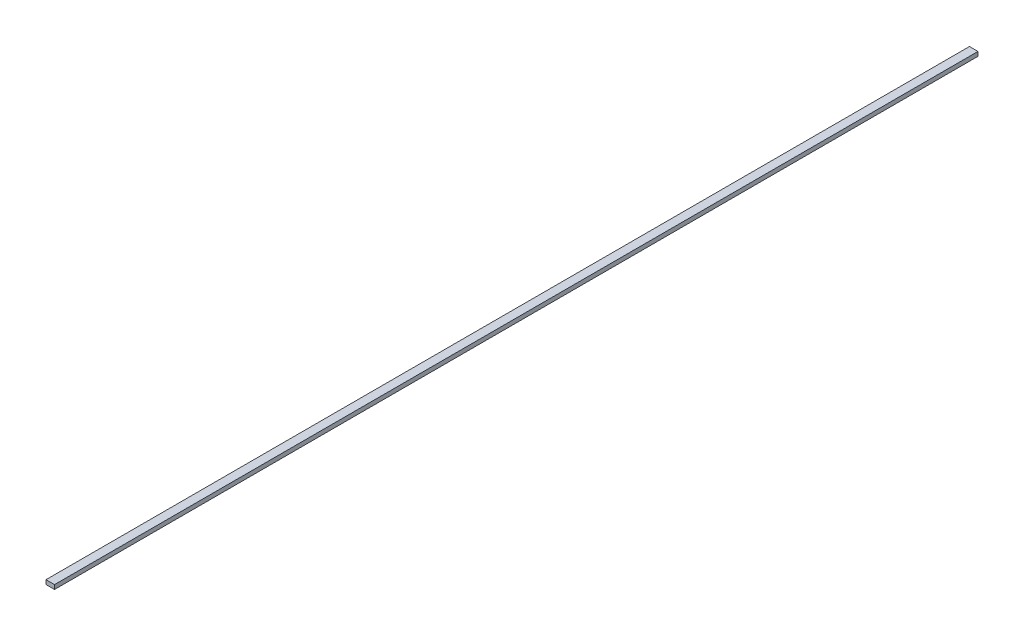
ISO-10303-21;
HEADER;
FILE_DESCRIPTION(('STEP AP214'),'2;1');
FILE_NAME('part.step','',(''),(''),'','','');
FILE_SCHEMA(('AUTOMOTIVE_DESIGN { 1 0 10303 214 1 1 1 1 }'));
ENDSEC;
DATA;
#1=APPLICATION_CONTEXT('core data for automotive mechanical design processes');
#2=APPLICATION_PROTOCOL_DEFINITION('international standard','automotive_design',2000,#1);
#3=PRODUCT_CONTEXT('',#1,'mechanical');
#4=PRODUCT('Part','Part','',(#3));
#5=PRODUCT_RELATED_PRODUCT_CATEGORY('part','',(#4));
#6=PRODUCT_DEFINITION_FORMATION('','',#4);
#7=PRODUCT_DEFINITION_CONTEXT('part definition',#1,'design');
#8=PRODUCT_DEFINITION('design','',#6,#7);
#9=PRODUCT_DEFINITION_SHAPE('','',#8);
#10=(LENGTH_UNIT() NAMED_UNIT(*) SI_UNIT(.MILLI.,.METRE.));
#11=(NAMED_UNIT(*) PLANE_ANGLE_UNIT() SI_UNIT($,.RADIAN.));
#12=(NAMED_UNIT(*) SI_UNIT($,.STERADIAN.) SOLID_ANGLE_UNIT());
#13=UNCERTAINTY_MEASURE_WITH_UNIT(LENGTH_MEASURE(1.E-05),#10,'distance_accuracy_value','');
#14=(GEOMETRIC_REPRESENTATION_CONTEXT(3) GLOBAL_UNCERTAINTY_ASSIGNED_CONTEXT((#13)) GLOBAL_UNIT_ASSIGNED_CONTEXT((#10,
#11,#12)) REPRESENTATION_CONTEXT('',''));
#15=CARTESIAN_POINT('',(0.,0.,0.));
#16=DIRECTION('',(0.,0.,1.));
#17=DIRECTION('',(1.,0.,0.));
#18=AXIS2_PLACEMENT_3D('',#15,#16,#17);
#19=CARTESIAN_POINT('',(717.,1550.,-690.));
#20=DIRECTION('',(-1.,0.,0.));
#21=DIRECTION('',(0.,0.,1.));
#22=AXIS2_PLACEMENT_3D('',#19,#20,#21);
#23=PLANE('',#22);
#24=DIRECTION('',(0.,-1.,0.));
#25=VECTOR('',#24,1.);
#26=CARTESIAN_POINT('',(717.,1550.,-40.));
#27=LINE('',#26,#25);
#28=CARTESIAN_POINT('',(717.,1553.,-40.));
#29=VERTEX_POINT('',#28);
#30=CARTESIAN_POINT('',(717.,1550.,-40.));
#31=VERTEX_POINT('',#30);
#32=EDGE_CURVE('E103',#29,#31,#27,.T.);
#33=ORIENTED_EDGE('',*,*,#32,.F.);
#34=DIRECTION('',(0.,0.,1.));
#35=VECTOR('',#34,1.);
#36=CARTESIAN_POINT('',(717.,1553.,-690.));
#37=LINE('',#36,#35);
#38=CARTESIAN_POINT('',(717.,1553.,-690.));
#39=VERTEX_POINT('',#38);
#40=EDGE_CURVE('E11',#39,#29,#37,.T.);
#41=ORIENTED_EDGE('',*,*,#40,.F.);
#42=DIRECTION('',(0.,-1.,0.));
#43=VECTOR('',#42,1.);
#44=CARTESIAN_POINT('',(717.,1550.,-690.));
#45=LINE('',#44,#43);
#46=CARTESIAN_POINT('',(717.,1550.,-690.));
#47=VERTEX_POINT('',#46);
#48=EDGE_CURVE('E97',#39,#47,#45,.T.);
#49=ORIENTED_EDGE('',*,*,#48,.T.);
#50=DIRECTION('',(0.,0.,1.));
#51=VECTOR('',#50,1.);
#52=CARTESIAN_POINT('',(717.,1550.,-690.));
#53=LINE('',#52,#51);
#54=EDGE_CURVE('E42',#47,#31,#53,.T.);
#55=ORIENTED_EDGE('',*,*,#54,.T.);
#56=EDGE_LOOP('',(#33,#41,#49,#55));
#57=FACE_BOUND('',#56,.T.);
#58=ADVANCED_FACE('F39',(#57),#23,.T.);
#59=CARTESIAN_POINT('',(717.,1553.,-690.));
#60=DIRECTION('',(0.,1.,0.));
#61=DIRECTION('',(0.,0.,1.));
#62=AXIS2_PLACEMENT_3D('',#59,#60,#61);
#63=PLANE('',#62);
#64=DIRECTION('',(-1.,0.,0.));
#65=VECTOR('',#64,1.);
#66=CARTESIAN_POINT('',(717.,1553.,-40.));
#67=LINE('',#66,#65);
#68=CARTESIAN_POINT('',(723.,1553.,-40.));
#69=VERTEX_POINT('',#68);
#70=EDGE_CURVE('E99',#69,#29,#67,.T.);
#71=ORIENTED_EDGE('',*,*,#70,.F.);
#72=DIRECTION('',(0.,0.,1.));
#73=VECTOR('',#72,1.);
#74=CARTESIAN_POINT('',(723.,1553.,-690.));
#75=LINE('',#74,#73);
#76=CARTESIAN_POINT('',(723.,1553.,-690.));
#77=VERTEX_POINT('',#76);
#78=EDGE_CURVE('E48',#77,#69,#75,.T.);
#79=ORIENTED_EDGE('',*,*,#78,.F.);
#80=DIRECTION('',(-1.,0.,0.));
#81=VECTOR('',#80,1.);
#82=CARTESIAN_POINT('',(717.,1553.,-690.));
#83=LINE('',#82,#81);
#84=EDGE_CURVE('E94',#77,#39,#83,.T.);
#85=ORIENTED_EDGE('',*,*,#84,.T.);
#86=ORIENTED_EDGE('',*,*,#40,.T.);
#87=EDGE_LOOP('',(#71,#79,#85,#86));
#88=FACE_BOUND('',#87,.T.);
#89=ADVANCED_FACE('F113',(#88),#63,.T.);
#90=CARTESIAN_POINT('',(723.,1550.,-690.));
#91=DIRECTION('',(1.,0.,0.));
#92=DIRECTION('',(0.,0.,-1.));
#93=AXIS2_PLACEMENT_3D('',#90,#91,#92);
#94=PLANE('',#93);
#95=DIRECTION('',(0.,1.,0.));
#96=VECTOR('',#95,1.);
#97=CARTESIAN_POINT('',(723.,1550.,-40.));
#98=LINE('',#97,#96);
#99=CARTESIAN_POINT('',(723.,1550.,-40.));
#100=VERTEX_POINT('',#99);
#101=EDGE_CURVE('E89',#100,#69,#98,.T.);
#102=ORIENTED_EDGE('',*,*,#101,.F.);
#103=DIRECTION('',(0.,0.,1.));
#104=VECTOR('',#103,1.);
#105=CARTESIAN_POINT('',(723.,1550.,-690.));
#106=LINE('',#105,#104);
#107=CARTESIAN_POINT('',(723.,1550.,-690.));
#108=VERTEX_POINT('',#107);
#109=EDGE_CURVE('E84',#108,#100,#106,.T.);
#110=ORIENTED_EDGE('',*,*,#109,.F.);
#111=DIRECTION('',(0.,1.,0.));
#112=VECTOR('',#111,1.);
#113=CARTESIAN_POINT('',(723.,1550.,-690.));
#114=LINE('',#113,#112);
#115=EDGE_CURVE('E87',#108,#77,#114,.T.);
#116=ORIENTED_EDGE('',*,*,#115,.T.);
#117=ORIENTED_EDGE('',*,*,#78,.T.);
#118=EDGE_LOOP('',(#102,#110,#116,#117));
#119=FACE_BOUND('',#118,.T.);
#120=ADVANCED_FACE('F86',(#119),#94,.T.);
#121=CARTESIAN_POINT('',(717.,1550.,-690.));
#122=DIRECTION('',(0.,-1.,0.));
#123=DIRECTION('',(0.,0.,-1.));
#124=AXIS2_PLACEMENT_3D('',#121,#122,#123);
#125=PLANE('',#124);
#126=DIRECTION('',(1.,0.,0.));
#127=VECTOR('',#126,1.);
#128=CARTESIAN_POINT('',(717.,1550.,-40.));
#129=LINE('',#128,#127);
#130=EDGE_CURVE('E106',#31,#100,#129,.T.);
#131=ORIENTED_EDGE('',*,*,#130,.F.);
#132=ORIENTED_EDGE('',*,*,#54,.F.);
#133=DIRECTION('',(1.,0.,0.));
#134=VECTOR('',#133,1.);
#135=CARTESIAN_POINT('',(717.,1550.,-690.));
#136=LINE('',#135,#134);
#137=EDGE_CURVE('E93',#47,#108,#136,.T.);
#138=ORIENTED_EDGE('',*,*,#137,.T.);
#139=ORIENTED_EDGE('',*,*,#109,.T.);
#140=EDGE_LOOP('',(#131,#132,#138,#139));
#141=FACE_BOUND('',#140,.T.);
#142=ADVANCED_FACE('F96',(#141),#125,.T.);
#143=CARTESIAN_POINT('',(0.,0.,-690.));
#144=DIRECTION('',(0.,0.,-1.));
#145=DIRECTION('',(-1.,0.,0.));
#146=AXIS2_PLACEMENT_3D('',#143,#144,#145);
#147=PLANE('',#146);
#148=ORIENTED_EDGE('',*,*,#48,.F.);
#149=ORIENTED_EDGE('',*,*,#84,.F.);
#150=ORIENTED_EDGE('',*,*,#115,.F.);
#151=ORIENTED_EDGE('',*,*,#137,.F.);
#152=EDGE_LOOP('',(#148,#149,#150,#151));
#153=FACE_BOUND('',#152,.T.);
#154=ADVANCED_FACE('F92',(#153),#147,.T.);
#155=CARTESIAN_POINT('',(0.,0.,-40.));
#156=DIRECTION('',(0.,0.,-1.));
#157=DIRECTION('',(-1.,0.,0.));
#158=AXIS2_PLACEMENT_3D('',#155,#156,#157);
#159=PLANE('',#158);
#160=ORIENTED_EDGE('',*,*,#32,.T.);
#161=ORIENTED_EDGE('',*,*,#130,.T.);
#162=ORIENTED_EDGE('',*,*,#101,.T.);
#163=ORIENTED_EDGE('',*,*,#70,.T.);
#164=EDGE_LOOP('',(#160,#161,#162,#163));
#165=FACE_BOUND('',#164,.T.);
#166=ADVANCED_FACE('F112',(#165),#159,.F.);
#167=CLOSED_SHELL('',(#58,#89,#120,#142,#154,#166));
#168=MANIFOLD_SOLID_BREP('B2',#167);
#169=ADVANCED_BREP_SHAPE_REPRESENTATION('',(#18,#168),#14);
#170=SHAPE_DEFINITION_REPRESENTATION(#9,#169);
ENDSEC;
END-ISO-10303-21;
